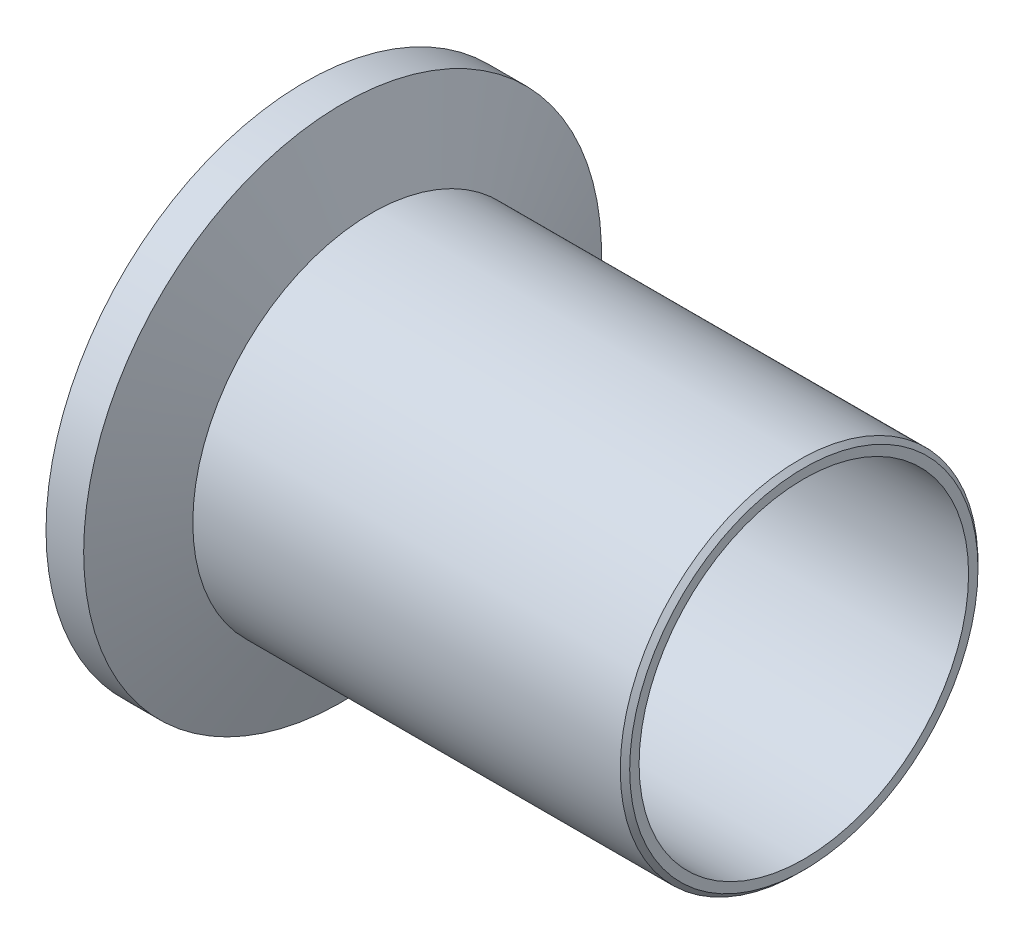
ISO-10303-21;
HEADER;
FILE_DESCRIPTION(('STEP AP214'),'2;1');
FILE_NAME('part.step','',(''),(''),'','','');
FILE_SCHEMA(('AUTOMOTIVE_DESIGN { 1 0 10303 214 1 1 1 1 }'));
ENDSEC;
DATA;
#1=APPLICATION_CONTEXT('core data for automotive mechanical design processes');
#2=APPLICATION_PROTOCOL_DEFINITION('international standard','automotive_design',2000,#1);
#3=PRODUCT_CONTEXT('',#1,'mechanical');
#4=PRODUCT('Part','Part','',(#3));
#5=PRODUCT_RELATED_PRODUCT_CATEGORY('part','',(#4));
#6=PRODUCT_DEFINITION_FORMATION('','',#4);
#7=PRODUCT_DEFINITION_CONTEXT('part definition',#1,'design');
#8=PRODUCT_DEFINITION('design','',#6,#7);
#9=PRODUCT_DEFINITION_SHAPE('','',#8);
#10=(LENGTH_UNIT() NAMED_UNIT(*) SI_UNIT(.MILLI.,.METRE.));
#11=(NAMED_UNIT(*) PLANE_ANGLE_UNIT() SI_UNIT($,.RADIAN.));
#12=(NAMED_UNIT(*) SI_UNIT($,.STERADIAN.) SOLID_ANGLE_UNIT());
#13=UNCERTAINTY_MEASURE_WITH_UNIT(LENGTH_MEASURE(1.E-05),#10,'distance_accuracy_value','');
#14=(GEOMETRIC_REPRESENTATION_CONTEXT(3) GLOBAL_UNCERTAINTY_ASSIGNED_CONTEXT((#13)) GLOBAL_UNIT_ASSIGNED_CONTEXT((#10,
#11,#12)) REPRESENTATION_CONTEXT('',''));
#15=CARTESIAN_POINT('',(0.,0.,0.));
#16=DIRECTION('',(0.,0.,1.));
#17=DIRECTION('',(1.,0.,0.));
#18=AXIS2_PLACEMENT_3D('',#15,#16,#17);
#19=CARTESIAN_POINT('',(0.,0.,0.));
#20=DIRECTION('',(-1.,0.,0.));
#21=DIRECTION('',(0.,0.,1.));
#22=AXIS2_PLACEMENT_3D('',#19,#20,#21);
#23=CYLINDRICAL_SURFACE('',#22,17.5);
#24=CARTESIAN_POINT('',(53.,0.,0.));
#25=DIRECTION('',(-1.,0.,0.));
#26=DIRECTION('',(0.,0.,1.));
#27=AXIS2_PLACEMENT_3D('',#24,#25,#26);
#28=CIRCLE('',#27,17.5);
#29=CARTESIAN_POINT('',(53.,0.,17.5));
#30=VERTEX_POINT('',#29);
#31=EDGE_CURVE('E76',#30,#30,#28,.T.);
#32=ORIENTED_EDGE('',*,*,#31,.F.);
#33=EDGE_LOOP('',(#32));
#34=FACE_BOUND('',#33,.T.);
#35=CARTESIAN_POINT('',(3.5,0.,0.));
#36=DIRECTION('',(-1.,0.,0.));
#37=DIRECTION('',(0.,0.,1.));
#38=AXIS2_PLACEMENT_3D('',#35,#36,#37);
#39=CIRCLE('',#38,17.5);
#40=CARTESIAN_POINT('',(3.5,0.,17.5));
#41=VERTEX_POINT('',#40);
#42=EDGE_CURVE('E67',#41,#41,#39,.F.);
#43=ORIENTED_EDGE('',*,*,#42,.F.);
#44=EDGE_LOOP('',(#43));
#45=FACE_BOUND('',#44,.T.);
#46=ADVANCED_FACE('F45',(#34,#45),#23,.F.);
#47=CARTESIAN_POINT('',(0.,0.,0.));
#48=DIRECTION('',(-1.,0.,0.));
#49=DIRECTION('',(0.,0.,1.));
#50=AXIS2_PLACEMENT_3D('',#47,#48,#49);
#51=CYLINDRICAL_SURFACE('',#50,27.5);
#52=CARTESIAN_POINT('',(0.,0.,0.));
#53=DIRECTION('',(-1.,0.,0.));
#54=DIRECTION('',(0.,0.,1.));
#55=AXIS2_PLACEMENT_3D('',#52,#53,#54);
#56=CIRCLE('',#55,27.5);
#57=CARTESIAN_POINT('',(0.,0.,27.5));
#58=VERTEX_POINT('',#57);
#59=EDGE_CURVE('E80',#58,#58,#56,.T.);
#60=ORIENTED_EDGE('',*,*,#59,.F.);
#61=EDGE_LOOP('',(#60));
#62=FACE_BOUND('',#61,.T.);
#63=CARTESIAN_POINT('',(4.,0.,0.));
#64=DIRECTION('',(-1.,0.,0.));
#65=DIRECTION('',(0.,0.,1.));
#66=AXIS2_PLACEMENT_3D('',#63,#64,#65);
#67=CIRCLE('',#66,27.5);
#68=CARTESIAN_POINT('',(4.,0.,27.5));
#69=VERTEX_POINT('',#68);
#70=EDGE_CURVE('E59',#69,#69,#67,.T.);
#71=ORIENTED_EDGE('',*,*,#70,.T.);
#72=EDGE_LOOP('',(#71));
#73=FACE_BOUND('',#72,.T.);
#74=ADVANCED_FACE('F127',(#62,#73),#51,.T.);
#75=CARTESIAN_POINT('',(7.09374699126269,0.,0.));
#76=DIRECTION('',(-1.,0.,0.));
#77=DIRECTION('',(0.,0.,1.));
#78=AXIS2_PLACEMENT_3D('',#75,#76,#77);
#79=CONICAL_SURFACE('',#78,19.,1.22173047639603);
#80=ORIENTED_EDGE('',*,*,#70,.F.);
#81=EDGE_LOOP('',(#80));
#82=FACE_BOUND('',#81,.T.);
#83=CARTESIAN_POINT('',(7.09374699126269,0.,0.));
#84=DIRECTION('',(-1.,0.,0.));
#85=DIRECTION('',(0.,0.,1.));
#86=AXIS2_PLACEMENT_3D('',#83,#84,#85);
#87=CIRCLE('',#86,19.);
#88=CARTESIAN_POINT('',(7.09374699126269,0.,19.));
#89=VERTEX_POINT('',#88);
#90=EDGE_CURVE('E64',#89,#89,#87,.T.);
#91=ORIENTED_EDGE('',*,*,#90,.T.);
#92=EDGE_LOOP('',(#91));
#93=FACE_BOUND('',#92,.T.);
#94=ADVANCED_FACE('F130',(#82,#93),#79,.T.);
#95=CARTESIAN_POINT('',(0.,0.,0.));
#96=DIRECTION('',(-1.,0.,0.));
#97=DIRECTION('',(0.,0.,1.));
#98=AXIS2_PLACEMENT_3D('',#95,#96,#97);
#99=CYLINDRICAL_SURFACE('',#98,19.);
#100=CARTESIAN_POINT('',(52.5,0.,0.));
#101=DIRECTION('',(-1.,0.,0.));
#102=DIRECTION('',(0.,0.,1.));
#103=AXIS2_PLACEMENT_3D('',#100,#101,#102);
#104=CIRCLE('',#103,19.);
#105=CARTESIAN_POINT('',(52.5,0.,19.));
#106=VERTEX_POINT('',#105);
#107=EDGE_CURVE('E54',#106,#106,#104,.T.);
#108=ORIENTED_EDGE('',*,*,#107,.T.);
#109=EDGE_LOOP('',(#108));
#110=FACE_BOUND('',#109,.T.);
#111=ORIENTED_EDGE('',*,*,#90,.F.);
#112=EDGE_LOOP('',(#111));
#113=FACE_BOUND('',#112,.T.);
#114=ADVANCED_FACE('F135',(#110,#113),#99,.T.);
#115=CARTESIAN_POINT('',(53.,19.,0.));
#116=DIRECTION('',(-1.,0.,0.));
#117=DIRECTION('',(0.,0.,1.));
#118=AXIS2_PLACEMENT_3D('',#115,#116,#117);
#119=PLANE('',#118);
#120=CARTESIAN_POINT('',(53.,0.,0.));
#121=DIRECTION('',(-1.,0.,0.));
#122=DIRECTION('',(0.,0.,1.));
#123=AXIS2_PLACEMENT_3D('',#120,#121,#122);
#124=CIRCLE('',#123,18.5);
#125=CARTESIAN_POINT('',(53.,0.,18.5));
#126=VERTEX_POINT('',#125);
#127=EDGE_CURVE('E10',#126,#126,#124,.F.);
#128=ORIENTED_EDGE('',*,*,#127,.T.);
#129=EDGE_LOOP('',(#128));
#130=FACE_BOUND('',#129,.T.);
#131=ORIENTED_EDGE('',*,*,#31,.T.);
#132=EDGE_LOOP('',(#131));
#133=FACE_BOUND('',#132,.T.);
#134=ADVANCED_FACE('F123',(#130,#133),#119,.F.);
#135=CARTESIAN_POINT('',(0.,17.5,0.));
#136=DIRECTION('',(1.,0.,0.));
#137=DIRECTION('',(0.,0.,-1.));
#138=AXIS2_PLACEMENT_3D('',#135,#136,#137);
#139=PLANE('',#138);
#140=CARTESIAN_POINT('',(0.,0.,0.));
#141=DIRECTION('',(-1.,0.,0.));
#142=DIRECTION('',(0.,0.,1.));
#143=AXIS2_PLACEMENT_3D('',#140,#141,#142);
#144=CIRCLE('',#143,20.5);
#145=CARTESIAN_POINT('',(0.,0.,20.5));
#146=VERTEX_POINT('',#145);
#147=EDGE_CURVE('E70',#146,#146,#144,.T.);
#148=ORIENTED_EDGE('',*,*,#147,.F.);
#149=EDGE_LOOP('',(#148));
#150=FACE_BOUND('',#149,.T.);
#151=ORIENTED_EDGE('',*,*,#59,.T.);
#152=EDGE_LOOP('',(#151));
#153=FACE_BOUND('',#152,.T.);
#154=ADVANCED_FACE('F112',(#150,#153),#139,.F.);
#155=CARTESIAN_POINT('',(3.,0.,0.));
#156=DIRECTION('',(-1.,0.,0.));
#157=DIRECTION('',(0.,0.,1.));
#158=AXIS2_PLACEMENT_3D('',#155,#156,#157);
#159=PLANE('',#158);
#160=CARTESIAN_POINT('',(3.,0.,0.));
#161=DIRECTION('',(-1.,0.,0.));
#162=DIRECTION('',(0.,0.,1.));
#163=AXIS2_PLACEMENT_3D('',#160,#161,#162);
#164=CIRCLE('',#163,18.);
#165=CARTESIAN_POINT('',(3.,0.,18.));
#166=VERTEX_POINT('',#165);
#167=EDGE_CURVE('E91',#166,#166,#164,.T.);
#168=ORIENTED_EDGE('',*,*,#167,.F.);
#169=EDGE_LOOP('',(#168));
#170=FACE_BOUND('',#169,.T.);
#171=CARTESIAN_POINT('',(3.,0.,0.));
#172=DIRECTION('',(-1.,0.,0.));
#173=DIRECTION('',(0.,0.,1.));
#174=AXIS2_PLACEMENT_3D('',#171,#172,#173);
#175=CIRCLE('',#174,20.5);
#176=CARTESIAN_POINT('',(3.,0.,20.5));
#177=VERTEX_POINT('',#176);
#178=EDGE_CURVE('E84',#177,#177,#175,.T.);
#179=ORIENTED_EDGE('',*,*,#178,.T.);
#180=EDGE_LOOP('',(#179));
#181=FACE_BOUND('',#180,.T.);
#182=ADVANCED_FACE('F108',(#170,#181),#159,.T.);
#183=CARTESIAN_POINT('',(3.,0.,0.));
#184=DIRECTION('',(-1.,0.,0.));
#185=DIRECTION('',(0.,0.,1.));
#186=AXIS2_PLACEMENT_3D('',#183,#184,#185);
#187=CYLINDRICAL_SURFACE('',#186,20.5);
#188=ORIENTED_EDGE('',*,*,#178,.F.);
#189=EDGE_LOOP('',(#188));
#190=FACE_BOUND('',#189,.T.);
#191=ORIENTED_EDGE('',*,*,#147,.T.);
#192=EDGE_LOOP('',(#191));
#193=FACE_BOUND('',#192,.T.);
#194=ADVANCED_FACE('F111',(#190,#193),#187,.F.);
#195=CARTESIAN_POINT('',(3.5,0.,0.));
#196=DIRECTION('',(-1.,0.,0.));
#197=DIRECTION('',(0.,0.,1.));
#198=AXIS2_PLACEMENT_3D('',#195,#196,#197);
#199=PLANE('',#198);
#200=CARTESIAN_POINT('',(3.5,0.,0.));
#201=DIRECTION('',(-1.,0.,0.));
#202=DIRECTION('',(0.,0.,1.));
#203=AXIS2_PLACEMENT_3D('',#200,#201,#202);
#204=CIRCLE('',#203,18.);
#205=CARTESIAN_POINT('',(3.5,0.,18.));
#206=VERTEX_POINT('',#205);
#207=EDGE_CURVE('E71',#206,#206,#204,.T.);
#208=ORIENTED_EDGE('',*,*,#207,.T.);
#209=EDGE_LOOP('',(#208));
#210=FACE_BOUND('',#209,.T.);
#211=ORIENTED_EDGE('',*,*,#42,.T.);
#212=EDGE_LOOP('',(#211));
#213=FACE_BOUND('',#212,.T.);
#214=ADVANCED_FACE('F99',(#210,#213),#199,.T.);
#215=CARTESIAN_POINT('',(3.5,0.,0.));
#216=DIRECTION('',(-1.,0.,0.));
#217=DIRECTION('',(0.,0.,1.));
#218=AXIS2_PLACEMENT_3D('',#215,#216,#217);
#219=CYLINDRICAL_SURFACE('',#218,18.);
#220=ORIENTED_EDGE('',*,*,#207,.F.);
#221=EDGE_LOOP('',(#220));
#222=FACE_BOUND('',#221,.T.);
#223=ORIENTED_EDGE('',*,*,#167,.T.);
#224=EDGE_LOOP('',(#223));
#225=FACE_BOUND('',#224,.T.);
#226=ADVANCED_FACE('F102',(#222,#225),#219,.F.);
#227=CARTESIAN_POINT('',(52.5,0.,0.));
#228=DIRECTION('',(-1.,0.,0.));
#229=DIRECTION('',(0.,0.,1.));
#230=AXIS2_PLACEMENT_3D('',#227,#228,#229);
#231=CONICAL_SURFACE('',#230,19.,0.785398163397438);
#232=ORIENTED_EDGE('',*,*,#127,.F.);
#233=EDGE_LOOP('',(#232));
#234=FACE_BOUND('',#233,.T.);
#235=ORIENTED_EDGE('',*,*,#107,.F.);
#236=EDGE_LOOP('',(#235));
#237=FACE_BOUND('',#236,.T.);
#238=ADVANCED_FACE('F48',(#234,#237),#231,.T.);
#239=CLOSED_SHELL('',(#46,#74,#94,#114,#134,#154,#182,#194,#214,#226,#238));
#240=MANIFOLD_SOLID_BREP('B2',#239);
#241=ADVANCED_BREP_SHAPE_REPRESENTATION('',(#18,#240),#14);
#242=SHAPE_DEFINITION_REPRESENTATION(#9,#241);
ENDSEC;
END-ISO-10303-21;
